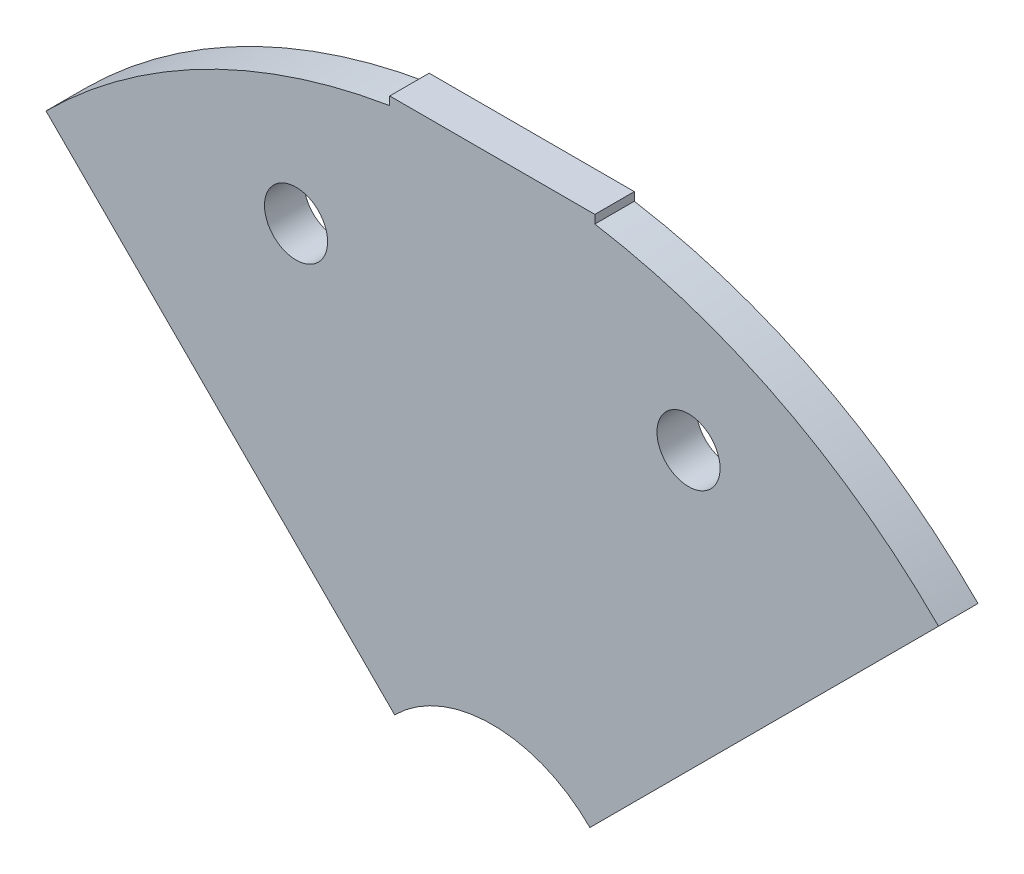
ISO-10303-21;
HEADER;
FILE_DESCRIPTION(('STEP AP214'),'2;1');
FILE_NAME('part.step','',(''),(''),'','','');
FILE_SCHEMA(('AUTOMOTIVE_DESIGN { 1 0 10303 214 1 1 1 1 }'));
ENDSEC;
DATA;
#1=APPLICATION_CONTEXT('core data for automotive mechanical design processes');
#2=APPLICATION_PROTOCOL_DEFINITION('international standard','automotive_design',2000,#1);
#3=PRODUCT_CONTEXT('',#1,'mechanical');
#4=PRODUCT('Part','Part','',(#3));
#5=PRODUCT_RELATED_PRODUCT_CATEGORY('part','',(#4));
#6=PRODUCT_DEFINITION_FORMATION('','',#4);
#7=PRODUCT_DEFINITION_CONTEXT('part definition',#1,'design');
#8=PRODUCT_DEFINITION('design','',#6,#7);
#9=PRODUCT_DEFINITION_SHAPE('','',#8);
#10=(LENGTH_UNIT() NAMED_UNIT(*) SI_UNIT(.MILLI.,.METRE.));
#11=(NAMED_UNIT(*) PLANE_ANGLE_UNIT() SI_UNIT($,.RADIAN.));
#12=(NAMED_UNIT(*) SI_UNIT($,.STERADIAN.) SOLID_ANGLE_UNIT());
#13=UNCERTAINTY_MEASURE_WITH_UNIT(LENGTH_MEASURE(1.E-05),#10,'distance_accuracy_value','');
#14=(GEOMETRIC_REPRESENTATION_CONTEXT(3) GLOBAL_UNCERTAINTY_ASSIGNED_CONTEXT((#13)) GLOBAL_UNIT_ASSIGNED_CONTEXT((#10,
#11,#12)) REPRESENTATION_CONTEXT('',''));
#15=CARTESIAN_POINT('',(0.,0.,0.));
#16=DIRECTION('',(0.,0.,1.));
#17=DIRECTION('',(1.,0.,0.));
#18=AXIS2_PLACEMENT_3D('',#15,#16,#17);
#19=CARTESIAN_POINT('',(0.,0.,5.));
#20=DIRECTION('',(0.,0.,-1.));
#21=DIRECTION('',(-1.,0.,0.));
#22=AXIS2_PLACEMENT_3D('',#19,#20,#21);
#23=CYLINDRICAL_SURFACE('',#22,80.);
#24=DIRECTION('',(0.,0.,-1.));
#25=VECTOR('',#24,1.);
#26=CARTESIAN_POINT('',(13.,78.9366834874636,5.));
#27=LINE('',#26,#25);
#28=CARTESIAN_POINT('',(13.0000000000001,78.9366834874635,5.));
#29=VERTEX_POINT('',#28);
#30=CARTESIAN_POINT('',(13.0000000000001,78.9366834874635,0.));
#31=VERTEX_POINT('',#30);
#32=EDGE_CURVE('E183',#29,#31,#27,.T.);
#33=ORIENTED_EDGE('',*,*,#32,.F.);
#34=CARTESIAN_POINT('',(0.,0.,5.));
#35=DIRECTION('',(0.,0.,1.));
#36=DIRECTION('',(1.,0.,0.));
#37=AXIS2_PLACEMENT_3D('',#34,#35,#36);
#38=CIRCLE('',#37,80.);
#39=CARTESIAN_POINT('',(56.5685424949238,56.5685424949238,5.));
#40=VERTEX_POINT('',#39);
#41=EDGE_CURVE('E42',#40,#29,#38,.T.);
#42=ORIENTED_EDGE('',*,*,#41,.F.);
#43=DIRECTION('',(0.,0.,-1.));
#44=VECTOR('',#43,1.);
#45=CARTESIAN_POINT('',(56.5685424949238,56.5685424949238,5.));
#46=LINE('',#45,#44);
#47=CARTESIAN_POINT('',(56.5685424949238,56.5685424949238,0.));
#48=VERTEX_POINT('',#47);
#49=EDGE_CURVE('E142',#40,#48,#46,.T.);
#50=ORIENTED_EDGE('',*,*,#49,.T.);
#51=CARTESIAN_POINT('',(0.,0.,0.));
#52=DIRECTION('',(0.,0.,1.));
#53=DIRECTION('',(1.,0.,0.));
#54=AXIS2_PLACEMENT_3D('',#51,#52,#53);
#55=CIRCLE('',#54,80.);
#56=EDGE_CURVE('E58',#48,#31,#55,.T.);
#57=ORIENTED_EDGE('',*,*,#56,.T.);
#58=EDGE_LOOP('',(#33,#42,#50,#57));
#59=FACE_BOUND('',#58,.T.);
#60=ADVANCED_FACE('F34',(#59),#23,.T.);
#61=DIRECTION('',(0.,0.,-1.));
#62=VECTOR('',#61,1.);
#63=CARTESIAN_POINT('',(-13.,78.9366834874636,5.));
#64=LINE('',#63,#62);
#65=CARTESIAN_POINT('',(-13.0000000000001,78.9366834874635,5.));
#66=VERTEX_POINT('',#65);
#67=CARTESIAN_POINT('',(-13.,78.9366834874636,0.));
#68=VERTEX_POINT('',#67);
#69=EDGE_CURVE('E50',#66,#68,#64,.T.);
#70=ORIENTED_EDGE('',*,*,#69,.T.);
#71=CARTESIAN_POINT('',(-56.5685424949238,56.5685424949238,0.));
#72=VERTEX_POINT('',#71);
#73=EDGE_CURVE('E162',#68,#72,#55,.T.);
#74=ORIENTED_EDGE('',*,*,#73,.T.);
#75=DIRECTION('',(0.,0.,-1.));
#76=VECTOR('',#75,1.);
#77=CARTESIAN_POINT('',(-56.5685424949238,56.5685424949238,5.));
#78=LINE('',#77,#76);
#79=CARTESIAN_POINT('',(-56.5685424949238,56.5685424949238,5.));
#80=VERTEX_POINT('',#79);
#81=EDGE_CURVE('E138',#80,#72,#78,.T.);
#82=ORIENTED_EDGE('',*,*,#81,.F.);
#83=EDGE_CURVE('E165',#66,#80,#38,.T.);
#84=ORIENTED_EDGE('',*,*,#83,.F.);
#85=EDGE_LOOP('',(#70,#74,#82,#84));
#86=FACE_BOUND('',#85,.T.);
#87=ADVANCED_FACE('F168',(#86),#23,.T.);
#88=CARTESIAN_POINT('',(0.,0.,5.));
#89=DIRECTION('',(0.,0.,1.));
#90=DIRECTION('',(1.,0.,0.));
#91=AXIS2_PLACEMENT_3D('',#88,#89,#90);
#92=PLANE('',#91);
#93=DIRECTION('',(0.,-1.,0.));
#94=VECTOR('',#93,1.);
#95=CARTESIAN_POINT('',(-13.,78.9366834874636,5.));
#96=LINE('',#95,#94);
#97=CARTESIAN_POINT('',(-13.,80.,5.));
#98=VERTEX_POINT('',#97);
#99=EDGE_CURVE('E112',#98,#66,#96,.T.);
#100=ORIENTED_EDGE('',*,*,#99,.T.);
#101=ORIENTED_EDGE('',*,*,#83,.T.);
#102=DIRECTION('',(-0.707106781186548,0.707106781186547,0.));
#103=VECTOR('',#102,1.);
#104=CARTESIAN_POINT('',(-12.3743686707646,12.3743686707646,5.));
#105=LINE('',#104,#103);
#106=CARTESIAN_POINT('',(-12.3743686707646,12.3743686707646,5.));
#107=VERTEX_POINT('',#106);
#108=EDGE_CURVE('E135',#107,#80,#105,.T.);
#109=ORIENTED_EDGE('',*,*,#108,.F.);
#110=CARTESIAN_POINT('',(0.,0.,5.));
#111=DIRECTION('',(0.,0.,-1.));
#112=DIRECTION('',(1.,0.,0.));
#113=AXIS2_PLACEMENT_3D('',#110,#111,#112);
#114=CIRCLE('',#113,17.5);
#115=CARTESIAN_POINT('',(12.3743686707646,12.3743686707646,5.));
#116=VERTEX_POINT('',#115);
#117=EDGE_CURVE('E11',#107,#116,#114,.T.);
#118=ORIENTED_EDGE('',*,*,#117,.T.);
#119=DIRECTION('',(-0.707106781186548,-0.707106781186547,0.));
#120=VECTOR('',#119,1.);
#121=CARTESIAN_POINT('',(56.5685424949238,56.5685424949238,5.));
#122=LINE('',#121,#120);
#123=EDGE_CURVE('E130',#40,#116,#122,.T.);
#124=ORIENTED_EDGE('',*,*,#123,.F.);
#125=ORIENTED_EDGE('',*,*,#41,.T.);
#126=DIRECTION('',(0.,1.,0.));
#127=VECTOR('',#126,1.);
#128=CARTESIAN_POINT('',(13.,78.9366834874636,5.));
#129=LINE('',#128,#127);
#130=CARTESIAN_POINT('',(13.,80.,5.));
#131=VERTEX_POINT('',#130);
#132=EDGE_CURVE('E113',#29,#131,#129,.T.);
#133=ORIENTED_EDGE('',*,*,#132,.T.);
#134=DIRECTION('',(-1.,0.,0.));
#135=VECTOR('',#134,1.);
#136=CARTESIAN_POINT('',(-13.,80.,5.));
#137=LINE('',#136,#135);
#138=EDGE_CURVE('E101',#131,#98,#137,.T.);
#139=ORIENTED_EDGE('',*,*,#138,.T.);
#140=EDGE_LOOP('',(#100,#101,#109,#118,#124,#125,#133,#139));
#141=FACE_BOUND('',#140,.T.);
#142=CARTESIAN_POINT('',(-24.8744231037305,60.0521696132338,5.));
#143=DIRECTION('',(0.,0.,1.));
#144=DIRECTION('',(-1.,0.,0.));
#145=AXIS2_PLACEMENT_3D('',#142,#143,#144);
#146=CIRCLE('',#145,4.);
#147=CARTESIAN_POINT('',(-28.8744231037305,60.0521696132338,5.));
#148=VERTEX_POINT('',#147);
#149=EDGE_CURVE('E159',#148,#148,#146,.T.);
#150=ORIENTED_EDGE('',*,*,#149,.F.);
#151=EDGE_LOOP('',(#150));
#152=FACE_BOUND('',#151,.T.);
#153=CARTESIAN_POINT('',(24.8744231037305,60.0521696132338,5.));
#154=DIRECTION('',(0.,0.,1.));
#155=DIRECTION('',(1.,0.,0.));
#156=AXIS2_PLACEMENT_3D('',#153,#154,#155);
#157=CIRCLE('',#156,4.);
#158=CARTESIAN_POINT('',(28.8744231037305,60.0521696132338,5.));
#159=VERTEX_POINT('',#158);
#160=EDGE_CURVE('E153',#159,#159,#157,.T.);
#161=ORIENTED_EDGE('',*,*,#160,.F.);
#162=EDGE_LOOP('',(#161));
#163=FACE_BOUND('',#162,.T.);
#164=ADVANCED_FACE('F117',(#141,#152,#163),#92,.T.);
#165=CARTESIAN_POINT('',(0.,0.,0.));
#166=DIRECTION('',(0.,0.,1.));
#167=DIRECTION('',(1.,0.,0.));
#168=AXIS2_PLACEMENT_3D('',#165,#166,#167);
#169=PLANE('',#168);
#170=DIRECTION('',(0.,1.,0.));
#171=VECTOR('',#170,1.);
#172=CARTESIAN_POINT('',(13.,78.9366834874636,0.));
#173=LINE('',#172,#171);
#174=CARTESIAN_POINT('',(13.,80.,0.));
#175=VERTEX_POINT('',#174);
#176=EDGE_CURVE('E126',#31,#175,#173,.T.);
#177=ORIENTED_EDGE('',*,*,#176,.F.);
#178=ORIENTED_EDGE('',*,*,#56,.F.);
#179=DIRECTION('',(-0.707106781186548,-0.707106781186547,0.));
#180=VECTOR('',#179,1.);
#181=CARTESIAN_POINT('',(56.5685424949238,56.5685424949238,0.));
#182=LINE('',#181,#180);
#183=CARTESIAN_POINT('',(12.3743686707646,12.3743686707646,0.));
#184=VERTEX_POINT('',#183);
#185=EDGE_CURVE('E127',#48,#184,#182,.T.);
#186=ORIENTED_EDGE('',*,*,#185,.T.);
#187=CARTESIAN_POINT('',(0.,0.,0.));
#188=DIRECTION('',(0.,0.,-1.));
#189=DIRECTION('',(1.,0.,0.));
#190=AXIS2_PLACEMENT_3D('',#187,#188,#189);
#191=CIRCLE('',#190,17.5);
#192=CARTESIAN_POINT('',(-12.3743686707646,12.3743686707646,0.));
#193=VERTEX_POINT('',#192);
#194=EDGE_CURVE('E37',#193,#184,#191,.T.);
#195=ORIENTED_EDGE('',*,*,#194,.F.);
#196=DIRECTION('',(-0.707106781186548,0.707106781186547,0.));
#197=VECTOR('',#196,1.);
#198=CARTESIAN_POINT('',(-12.3743686707646,12.3743686707646,0.));
#199=LINE('',#198,#197);
#200=EDGE_CURVE('E139',#193,#72,#199,.T.);
#201=ORIENTED_EDGE('',*,*,#200,.T.);
#202=ORIENTED_EDGE('',*,*,#73,.F.);
#203=DIRECTION('',(0.,-1.,0.));
#204=VECTOR('',#203,1.);
#205=CARTESIAN_POINT('',(-13.,78.9366834874636,0.));
#206=LINE('',#205,#204);
#207=CARTESIAN_POINT('',(-13.,80.,0.));
#208=VERTEX_POINT('',#207);
#209=EDGE_CURVE('E122',#208,#68,#206,.T.);
#210=ORIENTED_EDGE('',*,*,#209,.F.);
#211=DIRECTION('',(-1.,0.,0.));
#212=VECTOR('',#211,1.);
#213=CARTESIAN_POINT('',(-13.,80.,0.));
#214=LINE('',#213,#212);
#215=EDGE_CURVE('E189',#175,#208,#214,.T.);
#216=ORIENTED_EDGE('',*,*,#215,.F.);
#217=EDGE_LOOP('',(#177,#178,#186,#195,#201,#202,#210,#216));
#218=FACE_BOUND('',#217,.T.);
#219=CARTESIAN_POINT('',(24.8744231037305,60.0521696132338,0.));
#220=DIRECTION('',(0.,0.,1.));
#221=DIRECTION('',(1.,0.,0.));
#222=AXIS2_PLACEMENT_3D('',#219,#220,#221);
#223=CIRCLE('',#222,4.);
#224=CARTESIAN_POINT('',(28.8744231037305,60.0521696132338,0.));
#225=VERTEX_POINT('',#224);
#226=EDGE_CURVE('E148',#225,#225,#223,.T.);
#227=ORIENTED_EDGE('',*,*,#226,.T.);
#228=EDGE_LOOP('',(#227));
#229=FACE_BOUND('',#228,.T.);
#230=CARTESIAN_POINT('',(-24.8744231037305,60.0521696132338,0.));
#231=DIRECTION('',(0.,0.,1.));
#232=DIRECTION('',(-1.,0.,0.));
#233=AXIS2_PLACEMENT_3D('',#230,#231,#232);
#234=CIRCLE('',#233,4.);
#235=CARTESIAN_POINT('',(-28.8744231037305,60.0521696132338,0.));
#236=VERTEX_POINT('',#235);
#237=EDGE_CURVE('E156',#236,#236,#234,.T.);
#238=ORIENTED_EDGE('',*,*,#237,.T.);
#239=EDGE_LOOP('',(#238));
#240=FACE_BOUND('',#239,.T.);
#241=ADVANCED_FACE('F176',(#218,#229,#240),#169,.F.);
#242=CARTESIAN_POINT('',(0.,0.,5.));
#243=DIRECTION('',(0.,0.,-1.));
#244=DIRECTION('',(-1.,0.,0.));
#245=AXIS2_PLACEMENT_3D('',#242,#243,#244);
#246=CYLINDRICAL_SURFACE('',#245,17.5);
#247=DIRECTION('',(0.,0.,-1.));
#248=VECTOR('',#247,1.);
#249=CARTESIAN_POINT('',(-12.3743686707646,12.3743686707646,5.));
#250=LINE('',#249,#248);
#251=EDGE_CURVE('E145',#107,#193,#250,.T.);
#252=ORIENTED_EDGE('',*,*,#251,.T.);
#253=ORIENTED_EDGE('',*,*,#194,.T.);
#254=DIRECTION('',(0.,0.,-1.));
#255=VECTOR('',#254,1.);
#256=CARTESIAN_POINT('',(12.3743686707646,12.3743686707646,5.));
#257=LINE('',#256,#255);
#258=EDGE_CURVE('E149',#116,#184,#257,.T.);
#259=ORIENTED_EDGE('',*,*,#258,.F.);
#260=ORIENTED_EDGE('',*,*,#117,.F.);
#261=EDGE_LOOP('',(#252,#253,#259,#260));
#262=FACE_BOUND('',#261,.T.);
#263=ADVANCED_FACE('F180',(#262),#246,.F.);
#264=CARTESIAN_POINT('',(-24.8744231037305,60.0521696132338,5.));
#265=DIRECTION('',(0.,0.,-1.));
#266=DIRECTION('',(-1.,0.,0.));
#267=AXIS2_PLACEMENT_3D('',#264,#265,#266);
#268=CYLINDRICAL_SURFACE('',#267,4.);
#269=ORIENTED_EDGE('',*,*,#149,.T.);
#270=EDGE_LOOP('',(#269));
#271=FACE_BOUND('',#270,.T.);
#272=ORIENTED_EDGE('',*,*,#237,.F.);
#273=EDGE_LOOP('',(#272));
#274=FACE_BOUND('',#273,.T.);
#275=ADVANCED_FACE('F201',(#271,#274),#268,.F.);
#276=CARTESIAN_POINT('',(24.8744231037305,60.0521696132338,5.));
#277=DIRECTION('',(0.,0.,-1.));
#278=DIRECTION('',(-1.,0.,0.));
#279=AXIS2_PLACEMENT_3D('',#276,#277,#278);
#280=CYLINDRICAL_SURFACE('',#279,4.);
#281=ORIENTED_EDGE('',*,*,#160,.T.);
#282=EDGE_LOOP('',(#281));
#283=FACE_BOUND('',#282,.T.);
#284=ORIENTED_EDGE('',*,*,#226,.F.);
#285=EDGE_LOOP('',(#284));
#286=FACE_BOUND('',#285,.T.);
#287=ADVANCED_FACE('F194',(#283,#286),#280,.F.);
#288=CARTESIAN_POINT('',(56.5685424949238,56.5685424949238,5.));
#289=DIRECTION('',(0.707106781186547,-0.707106781186548,0.));
#290=DIRECTION('',(0.707106781186548,0.707106781186547,0.));
#291=AXIS2_PLACEMENT_3D('',#288,#289,#290);
#292=PLANE('',#291);
#293=ORIENTED_EDGE('',*,*,#185,.F.);
#294=ORIENTED_EDGE('',*,*,#49,.F.);
#295=ORIENTED_EDGE('',*,*,#123,.T.);
#296=ORIENTED_EDGE('',*,*,#258,.T.);
#297=EDGE_LOOP('',(#293,#294,#295,#296));
#298=FACE_BOUND('',#297,.T.);
#299=ADVANCED_FACE('F192',(#298),#292,.T.);
#300=CARTESIAN_POINT('',(-12.3743686707646,12.3743686707646,5.));
#301=DIRECTION('',(-0.707106781186547,-0.707106781186548,0.));
#302=DIRECTION('',(0.707106781186548,-0.707106781186547,0.));
#303=AXIS2_PLACEMENT_3D('',#300,#301,#302);
#304=PLANE('',#303);
#305=ORIENTED_EDGE('',*,*,#200,.F.);
#306=ORIENTED_EDGE('',*,*,#251,.F.);
#307=ORIENTED_EDGE('',*,*,#108,.T.);
#308=ORIENTED_EDGE('',*,*,#81,.T.);
#309=EDGE_LOOP('',(#305,#306,#307,#308));
#310=FACE_BOUND('',#309,.T.);
#311=ADVANCED_FACE('F173',(#310),#304,.T.);
#312=CARTESIAN_POINT('',(-13.,80.,5.));
#313=DIRECTION('',(0.,-1.,0.));
#314=DIRECTION('',(0.,0.,-1.));
#315=AXIS2_PLACEMENT_3D('',#312,#313,#314);
#316=PLANE('',#315);
#317=ORIENTED_EDGE('',*,*,#138,.F.);
#318=DIRECTION('',(0.,0.,-1.));
#319=VECTOR('',#318,1.);
#320=CARTESIAN_POINT('',(13.,80.,5.));
#321=LINE('',#320,#319);
#322=EDGE_CURVE('E105',#131,#175,#321,.T.);
#323=ORIENTED_EDGE('',*,*,#322,.T.);
#324=ORIENTED_EDGE('',*,*,#215,.T.);
#325=DIRECTION('',(0.,0.,-1.));
#326=VECTOR('',#325,1.);
#327=CARTESIAN_POINT('',(-13.,80.,5.));
#328=LINE('',#327,#326);
#329=EDGE_CURVE('E108',#98,#208,#328,.T.);
#330=ORIENTED_EDGE('',*,*,#329,.F.);
#331=EDGE_LOOP('',(#317,#323,#324,#330));
#332=FACE_BOUND('',#331,.T.);
#333=ADVANCED_FACE('F103',(#332),#316,.F.);
#334=CARTESIAN_POINT('',(13.,78.9366834874636,5.));
#335=DIRECTION('',(-1.,0.,0.));
#336=DIRECTION('',(0.,0.,1.));
#337=AXIS2_PLACEMENT_3D('',#334,#335,#336);
#338=PLANE('',#337);
#339=ORIENTED_EDGE('',*,*,#176,.T.);
#340=ORIENTED_EDGE('',*,*,#322,.F.);
#341=ORIENTED_EDGE('',*,*,#132,.F.);
#342=ORIENTED_EDGE('',*,*,#32,.T.);
#343=EDGE_LOOP('',(#339,#340,#341,#342));
#344=FACE_BOUND('',#343,.T.);
#345=ADVANCED_FACE('F124',(#344),#338,.F.);
#346=CARTESIAN_POINT('',(-13.,78.9366834874636,5.));
#347=DIRECTION('',(1.,0.,0.));
#348=DIRECTION('',(0.,0.,-1.));
#349=AXIS2_PLACEMENT_3D('',#346,#347,#348);
#350=PLANE('',#349);
#351=ORIENTED_EDGE('',*,*,#209,.T.);
#352=ORIENTED_EDGE('',*,*,#69,.F.);
#353=ORIENTED_EDGE('',*,*,#99,.F.);
#354=ORIENTED_EDGE('',*,*,#329,.T.);
#355=EDGE_LOOP('',(#351,#352,#353,#354));
#356=FACE_BOUND('',#355,.T.);
#357=ADVANCED_FACE('F185',(#356),#350,.F.);
#358=CLOSED_SHELL('',(#60,#87,#164,#241,#263,#275,#287,#299,#311,#333,#345,#357));
#359=MANIFOLD_SOLID_BREP('B2',#358);
#360=ADVANCED_BREP_SHAPE_REPRESENTATION('',(#18,#359),#14);
#361=SHAPE_DEFINITION_REPRESENTATION(#9,#360);
ENDSEC;
END-ISO-10303-21;
